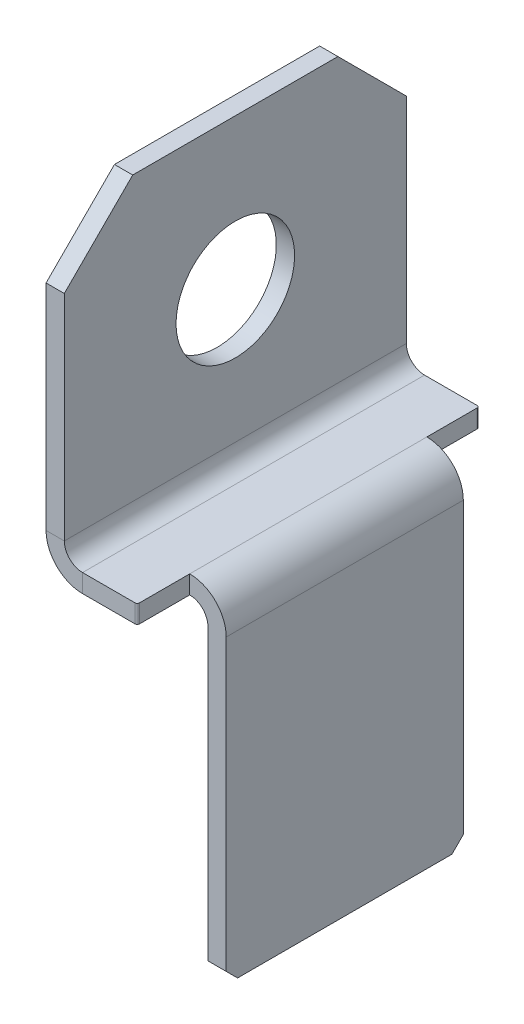
ISO-10303-21;
HEADER;
FILE_DESCRIPTION(('STEP AP214'),'2;1');
FILE_NAME('part.step','',(''),(''),'','','');
FILE_SCHEMA(('AUTOMOTIVE_DESIGN { 1 0 10303 214 1 1 1 1 }'));
ENDSEC;
DATA;
#1=APPLICATION_CONTEXT('core data for automotive mechanical design processes');
#2=APPLICATION_PROTOCOL_DEFINITION('international standard','automotive_design',2000,#1);
#3=PRODUCT_CONTEXT('',#1,'mechanical');
#4=PRODUCT('Part','Part','',(#3));
#5=PRODUCT_RELATED_PRODUCT_CATEGORY('part','',(#4));
#6=PRODUCT_DEFINITION_FORMATION('','',#4);
#7=PRODUCT_DEFINITION_CONTEXT('part definition',#1,'design');
#8=PRODUCT_DEFINITION('design','',#6,#7);
#9=PRODUCT_DEFINITION_SHAPE('','',#8);
#10=(LENGTH_UNIT() NAMED_UNIT(*) SI_UNIT(.MILLI.,.METRE.));
#11=(NAMED_UNIT(*) PLANE_ANGLE_UNIT() SI_UNIT($,.RADIAN.));
#12=(NAMED_UNIT(*) SI_UNIT($,.STERADIAN.) SOLID_ANGLE_UNIT());
#13=UNCERTAINTY_MEASURE_WITH_UNIT(LENGTH_MEASURE(1.E-05),#10,'distance_accuracy_value','');
#14=(GEOMETRIC_REPRESENTATION_CONTEXT(3) GLOBAL_UNCERTAINTY_ASSIGNED_CONTEXT((#13)) GLOBAL_UNIT_ASSIGNED_CONTEXT((#10,
#11,#12)) REPRESENTATION_CONTEXT('',''));
#15=CARTESIAN_POINT('',(0.,0.,0.));
#16=DIRECTION('',(0.,0.,1.));
#17=DIRECTION('',(1.,0.,0.));
#18=AXIS2_PLACEMENT_3D('',#15,#16,#17);
#19=CARTESIAN_POINT('',(0.8,0.,15.));
#20=DIRECTION('',(-1.,0.,0.));
#21=DIRECTION('',(0.,0.,1.));
#22=AXIS2_PLACEMENT_3D('',#19,#20,#21);
#23=PLANE('',#22);
#24=DIRECTION('',(0.,1.,0.));
#25=VECTOR('',#24,1.);
#26=CARTESIAN_POINT('',(0.8,0.,12.7));
#27=LINE('',#26,#25);
#28=CARTESIAN_POINT('',(0.8,0.5,12.7));
#29=VERTEX_POINT('',#28);
#30=CARTESIAN_POINT('',(0.8,13.2,12.7));
#31=VERTEX_POINT('',#30);
#32=EDGE_CURVE('E198',#29,#31,#27,.T.);
#33=ORIENTED_EDGE('',*,*,#32,.F.);
#34=DIRECTION('',(0.,-0.70710678118655,-0.707106781186545));
#35=VECTOR('',#34,1.);
#36=CARTESIAN_POINT('',(0.8,0.5,12.7));
#37=LINE('',#36,#35);
#38=CARTESIAN_POINT('',(0.8,0.,12.2));
#39=VERTEX_POINT('',#38);
#40=EDGE_CURVE('E283',#29,#39,#37,.T.);
#41=ORIENTED_EDGE('',*,*,#40,.T.);
#42=DIRECTION('',(0.,0.,-1.));
#43=VECTOR('',#42,1.);
#44=CARTESIAN_POINT('',(0.8,0.,15.));
#45=LINE('',#44,#43);
#46=CARTESIAN_POINT('',(0.8,0.,2.8));
#47=VERTEX_POINT('',#46);
#48=EDGE_CURVE('E300',#39,#47,#45,.T.);
#49=ORIENTED_EDGE('',*,*,#48,.T.);
#50=DIRECTION('',(0.,-0.70710678118655,0.707106781186545));
#51=VECTOR('',#50,1.);
#52=CARTESIAN_POINT('',(0.8,0.5,2.3));
#53=LINE('',#52,#51);
#54=CARTESIAN_POINT('',(0.8,0.5,2.3));
#55=VERTEX_POINT('',#54);
#56=EDGE_CURVE('E281',#47,#55,#53,.F.);
#57=ORIENTED_EDGE('',*,*,#56,.T.);
#58=DIRECTION('',(0.,-1.,0.));
#59=VECTOR('',#58,1.);
#60=CARTESIAN_POINT('',(0.8,0.,2.3));
#61=LINE('',#60,#59);
#62=CARTESIAN_POINT('',(0.8,13.2,2.3));
#63=VERTEX_POINT('',#62);
#64=EDGE_CURVE('E355',#63,#55,#61,.T.);
#65=ORIENTED_EDGE('',*,*,#64,.F.);
#66=DIRECTION('',(0.,0.,-1.));
#67=VECTOR('',#66,1.);
#68=CARTESIAN_POINT('',(0.8,13.2,15.));
#69=LINE('',#68,#67);
#70=EDGE_CURVE('E305',#31,#63,#69,.T.);
#71=ORIENTED_EDGE('',*,*,#70,.F.);
#72=EDGE_LOOP('',(#33,#41,#49,#57,#65,#71));
#73=FACE_BOUND('',#72,.T.);
#74=ADVANCED_FACE('F38',(#73),#23,.F.);
#75=CARTESIAN_POINT('',(-0.8,13.2,15.));
#76=DIRECTION('',(0.,0.,-1.));
#77=DIRECTION('',(-1.,0.,0.));
#78=AXIS2_PLACEMENT_3D('',#75,#76,#77);
#79=CYLINDRICAL_SURFACE('',#78,0.8);
#80=CARTESIAN_POINT('',(-0.8,13.2,12.7));
#81=DIRECTION('',(0.,0.,-1.));
#82=DIRECTION('',(-1.,0.,0.));
#83=AXIS2_PLACEMENT_3D('',#80,#81,#82);
#84=CIRCLE('',#83,0.8);
#85=CARTESIAN_POINT('',(-0.8,14.,12.7));
#86=VERTEX_POINT('',#85);
#87=CARTESIAN_POINT('',(0.,13.2,12.7));
#88=VERTEX_POINT('',#87);
#89=EDGE_CURVE('E193',#86,#88,#84,.T.);
#90=ORIENTED_EDGE('',*,*,#89,.F.);
#91=DIRECTION('',(0.,0.,-1.));
#92=VECTOR('',#91,1.);
#93=CARTESIAN_POINT('',(-0.8,14.,15.));
#94=LINE('',#93,#92);
#95=CARTESIAN_POINT('',(-0.8,14.,2.3));
#96=VERTEX_POINT('',#95);
#97=EDGE_CURVE('E187',#86,#96,#94,.T.);
#98=ORIENTED_EDGE('',*,*,#97,.T.);
#99=CARTESIAN_POINT('',(-0.8,13.2,2.3));
#100=DIRECTION('',(0.,0.,-1.));
#101=DIRECTION('',(-1.,0.,0.));
#102=AXIS2_PLACEMENT_3D('',#99,#100,#101);
#103=CIRCLE('',#102,0.8);
#104=CARTESIAN_POINT('',(0.,13.2,2.3));
#105=VERTEX_POINT('',#104);
#106=EDGE_CURVE('E336',#96,#105,#103,.T.);
#107=ORIENTED_EDGE('',*,*,#106,.T.);
#108=DIRECTION('',(0.,0.,-1.));
#109=VECTOR('',#108,1.);
#110=CARTESIAN_POINT('',(0.,13.2,15.));
#111=LINE('',#110,#109);
#112=EDGE_CURVE('E207',#88,#105,#111,.T.);
#113=ORIENTED_EDGE('',*,*,#112,.F.);
#114=EDGE_LOOP('',(#90,#98,#107,#113));
#115=FACE_BOUND('',#114,.T.);
#116=ADVANCED_FACE('F204',(#115),#79,.F.);
#117=CARTESIAN_POINT('',(0.,0.,15.));
#118=DIRECTION('',(-1.,0.,0.));
#119=DIRECTION('',(0.,0.,1.));
#120=AXIS2_PLACEMENT_3D('',#117,#118,#119);
#121=PLANE('',#120);
#122=DIRECTION('',(0.,0.,-1.));
#123=VECTOR('',#122,1.);
#124=CARTESIAN_POINT('',(0.,0.,15.));
#125=LINE('',#124,#123);
#126=CARTESIAN_POINT('',(0.,0.,12.2));
#127=VERTEX_POINT('',#126);
#128=CARTESIAN_POINT('',(0.,0.,2.8));
#129=VERTEX_POINT('',#128);
#130=EDGE_CURVE('E214',#127,#129,#125,.T.);
#131=ORIENTED_EDGE('',*,*,#130,.F.);
#132=DIRECTION('',(0.,0.70710678118655,0.707106781186545));
#133=VECTOR('',#132,1.);
#134=CARTESIAN_POINT('',(0.,1.4,13.6));
#135=LINE('',#134,#133);
#136=CARTESIAN_POINT('',(0.,0.5,12.7));
#137=VERTEX_POINT('',#136);
#138=EDGE_CURVE('E46',#127,#137,#135,.T.);
#139=ORIENTED_EDGE('',*,*,#138,.T.);
#140=DIRECTION('',(0.,-1.,0.));
#141=VECTOR('',#140,1.);
#142=CARTESIAN_POINT('',(0.,0.,12.7));
#143=LINE('',#142,#141);
#144=EDGE_CURVE('E209',#88,#137,#143,.T.);
#145=ORIENTED_EDGE('',*,*,#144,.F.);
#146=ORIENTED_EDGE('',*,*,#112,.T.);
#147=DIRECTION('',(0.,-1.,0.));
#148=VECTOR('',#147,1.);
#149=CARTESIAN_POINT('',(0.,0.,2.3));
#150=LINE('',#149,#148);
#151=CARTESIAN_POINT('',(0.,0.5,2.3));
#152=VERTEX_POINT('',#151);
#153=EDGE_CURVE('E352',#105,#152,#150,.T.);
#154=ORIENTED_EDGE('',*,*,#153,.T.);
#155=DIRECTION('',(0.,0.70710678118655,-0.707106781186545));
#156=VECTOR('',#155,1.);
#157=CARTESIAN_POINT('',(0.,-6.1,8.89999999999996));
#158=LINE('',#157,#156);
#159=EDGE_CURVE('E53',#152,#129,#158,.F.);
#160=ORIENTED_EDGE('',*,*,#159,.T.);
#161=EDGE_LOOP('',(#131,#139,#145,#146,#154,#160));
#162=FACE_BOUND('',#161,.T.);
#163=ADVANCED_FACE('F290',(#162),#121,.T.);
#164=CARTESIAN_POINT('',(0.8,0.,15.));
#165=DIRECTION('',(0.,-1.,0.));
#166=DIRECTION('',(0.,0.,-1.));
#167=AXIS2_PLACEMENT_3D('',#164,#165,#166);
#168=PLANE('',#167);
#169=ORIENTED_EDGE('',*,*,#48,.F.);
#170=DIRECTION('',(-1.,0.,0.));
#171=VECTOR('',#170,1.);
#172=CARTESIAN_POINT('',(0.,0.,12.2));
#173=LINE('',#172,#171);
#174=EDGE_CURVE('E287',#39,#127,#173,.T.);
#175=ORIENTED_EDGE('',*,*,#174,.T.);
#176=ORIENTED_EDGE('',*,*,#130,.T.);
#177=DIRECTION('',(1.,0.,0.));
#178=VECTOR('',#177,1.);
#179=CARTESIAN_POINT('',(0.8,0.,2.8));
#180=LINE('',#179,#178);
#181=EDGE_CURVE('E285',#129,#47,#180,.T.);
#182=ORIENTED_EDGE('',*,*,#181,.T.);
#183=EDGE_LOOP('',(#169,#175,#176,#182));
#184=FACE_BOUND('',#183,.T.);
#185=ADVANCED_FACE('F304',(#184),#168,.T.);
#186=CARTESIAN_POINT('',(-0.8,13.2,15.));
#187=DIRECTION('',(0.,0.,-1.));
#188=DIRECTION('',(-1.,0.,0.));
#189=AXIS2_PLACEMENT_3D('',#186,#187,#188);
#190=CYLINDRICAL_SURFACE('',#189,1.6);
#191=DIRECTION('',(0.,0.,-1.));
#192=VECTOR('',#191,1.);
#193=CARTESIAN_POINT('',(-0.8,14.8,15.));
#194=LINE('',#193,#192);
#195=CARTESIAN_POINT('',(-0.8,14.8,12.7));
#196=VERTEX_POINT('',#195);
#197=CARTESIAN_POINT('',(-0.8,14.8,2.3));
#198=VERTEX_POINT('',#197);
#199=EDGE_CURVE('E311',#196,#198,#194,.T.);
#200=ORIENTED_EDGE('',*,*,#199,.F.);
#201=CARTESIAN_POINT('',(-0.8,13.2,12.7));
#202=DIRECTION('',(0.,0.,-1.));
#203=DIRECTION('',(-1.,0.,0.));
#204=AXIS2_PLACEMENT_3D('',#201,#202,#203);
#205=CIRCLE('',#204,1.6);
#206=EDGE_CURVE('E196',#196,#31,#205,.T.);
#207=ORIENTED_EDGE('',*,*,#206,.T.);
#208=ORIENTED_EDGE('',*,*,#70,.T.);
#209=CARTESIAN_POINT('',(-0.8,13.2,2.3));
#210=DIRECTION('',(0.,0.,-1.));
#211=DIRECTION('',(-1.,0.,0.));
#212=AXIS2_PLACEMENT_3D('',#209,#210,#211);
#213=CIRCLE('',#212,1.6);
#214=EDGE_CURVE('E239',#198,#63,#213,.T.);
#215=ORIENTED_EDGE('',*,*,#214,.F.);
#216=EDGE_LOOP('',(#200,#207,#208,#215));
#217=FACE_BOUND('',#216,.T.);
#218=ADVANCED_FACE('F445',(#217),#190,.T.);
#219=CARTESIAN_POINT('',(0.8,13.2,15.));
#220=DIRECTION('',(0.,0.,1.));
#221=DIRECTION('',(1.,0.,0.));
#222=AXIS2_PLACEMENT_3D('',#219,#220,#221);
#223=PLANE('',#222);
#224=DIRECTION('',(-1.,0.,0.));
#225=VECTOR('',#224,1.);
#226=CARTESIAN_POINT('',(0.,14.,15.));
#227=LINE('',#226,#225);
#228=CARTESIAN_POINT('',(-0.9,14.,15.));
#229=VERTEX_POINT('',#228);
#230=CARTESIAN_POINT('',(-3.2,14.,15.));
#231=VERTEX_POINT('',#230);
#232=EDGE_CURVE('E341',#229,#231,#227,.T.);
#233=ORIENTED_EDGE('',*,*,#232,.F.);
#234=DIRECTION('',(0.,1.,0.));
#235=VECTOR('',#234,1.);
#236=CARTESIAN_POINT('',(-0.9,13.2,15.));
#237=LINE('',#236,#235);
#238=CARTESIAN_POINT('',(-0.9,14.8,15.));
#239=VERTEX_POINT('',#238);
#240=EDGE_CURVE('E261',#229,#239,#237,.T.);
#241=ORIENTED_EDGE('',*,*,#240,.T.);
#242=DIRECTION('',(1.,0.,0.));
#243=VECTOR('',#242,1.);
#244=CARTESIAN_POINT('',(0.,14.8,15.));
#245=LINE('',#244,#243);
#246=CARTESIAN_POINT('',(-3.2,14.8,15.));
#247=VERTEX_POINT('',#246);
#248=EDGE_CURVE('E339',#239,#247,#245,.F.);
#249=ORIENTED_EDGE('',*,*,#248,.T.);
#250=DIRECTION('',(0.,-1.,0.));
#251=VECTOR('',#250,1.);
#252=CARTESIAN_POINT('',(-3.2,14.8,15.));
#253=LINE('',#252,#251);
#254=EDGE_CURVE('E234',#247,#231,#253,.T.);
#255=ORIENTED_EDGE('',*,*,#254,.T.);
#256=EDGE_LOOP('',(#233,#241,#249,#255));
#257=FACE_BOUND('',#256,.T.);
#258=ADVANCED_FACE('F431',(#257),#223,.T.);
#259=CARTESIAN_POINT('',(-4.8,15.6,15.));
#260=DIRECTION('',(0.,0.,1.));
#261=DIRECTION('',(1.,0.,0.));
#262=AXIS2_PLACEMENT_3D('',#259,#260,#261);
#263=PLANE('',#262);
#264=DIRECTION('',(1.,0.,0.));
#265=VECTOR('',#264,1.);
#266=CARTESIAN_POINT('',(-4.8,15.6,15.));
#267=LINE('',#266,#265);
#268=CARTESIAN_POINT('',(-4.8,15.6,15.));
#269=VERTEX_POINT('',#268);
#270=CARTESIAN_POINT('',(-4.,15.6,15.));
#271=VERTEX_POINT('',#270);
#272=EDGE_CURVE('E237',#269,#271,#267,.T.);
#273=ORIENTED_EDGE('',*,*,#272,.F.);
#274=CARTESIAN_POINT('',(-3.2,15.6,15.));
#275=DIRECTION('',(0.,0.,1.));
#276=DIRECTION('',(1.,0.,0.));
#277=AXIS2_PLACEMENT_3D('',#274,#275,#276);
#278=CIRCLE('',#277,1.6);
#279=EDGE_CURVE('E343',#231,#269,#278,.F.);
#280=ORIENTED_EDGE('',*,*,#279,.F.);
#281=ORIENTED_EDGE('',*,*,#254,.F.);
#282=CARTESIAN_POINT('',(-3.2,15.6,15.));
#283=DIRECTION('',(0.,0.,1.));
#284=DIRECTION('',(1.,0.,0.));
#285=AXIS2_PLACEMENT_3D('',#282,#283,#284);
#286=CIRCLE('',#285,0.8);
#287=EDGE_CURVE('E318',#247,#271,#286,.F.);
#288=ORIENTED_EDGE('',*,*,#287,.T.);
#289=EDGE_LOOP('',(#273,#280,#281,#288));
#290=FACE_BOUND('',#289,.T.);
#291=ADVANCED_FACE('F412',(#290),#263,.T.);
#292=CARTESIAN_POINT('',(-3.2,14.8,15.));
#293=DIRECTION('',(0.,0.,1.));
#294=DIRECTION('',(1.,0.,0.));
#295=AXIS2_PLACEMENT_3D('',#292,#293,#294);
#296=PLANE('',#295);
#297=DIRECTION('',(0.,1.,0.));
#298=VECTOR('',#297,1.);
#299=CARTESIAN_POINT('',(-4.,14.,15.));
#300=LINE('',#299,#298);
#301=CARTESIAN_POINT('',(-4.,25.,15.));
#302=VERTEX_POINT('',#301);
#303=EDGE_CURVE('E322',#271,#302,#300,.T.);
#304=ORIENTED_EDGE('',*,*,#303,.T.);
#305=DIRECTION('',(-1.,0.,0.));
#306=VECTOR('',#305,1.);
#307=CARTESIAN_POINT('',(-3.2,25.,15.));
#308=LINE('',#307,#306);
#309=CARTESIAN_POINT('',(-4.8,25.,15.));
#310=VERTEX_POINT('',#309);
#311=EDGE_CURVE('E252',#302,#310,#308,.T.);
#312=ORIENTED_EDGE('',*,*,#311,.T.);
#313=DIRECTION('',(0.,1.,0.));
#314=VECTOR('',#313,1.);
#315=CARTESIAN_POINT('',(-4.8,14.,15.));
#316=LINE('',#315,#314);
#317=EDGE_CURVE('E346',#269,#310,#316,.T.);
#318=ORIENTED_EDGE('',*,*,#317,.F.);
#319=ORIENTED_EDGE('',*,*,#272,.T.);
#320=EDGE_LOOP('',(#304,#312,#318,#319));
#321=FACE_BOUND('',#320,.T.);
#322=ADVANCED_FACE('F416',(#321),#296,.T.);
#323=CARTESIAN_POINT('',(-3.2,14.,0.));
#324=DIRECTION('',(0.,0.,-1.));
#325=DIRECTION('',(-1.,0.,0.));
#326=AXIS2_PLACEMENT_3D('',#323,#324,#325);
#327=PLANE('',#326);
#328=DIRECTION('',(0.,1.,0.));
#329=VECTOR('',#328,1.);
#330=CARTESIAN_POINT('',(-3.2,14.,0.));
#331=LINE('',#330,#329);
#332=CARTESIAN_POINT('',(-3.2,14.,0.));
#333=VERTEX_POINT('',#332);
#334=CARTESIAN_POINT('',(-3.2,14.8,0.));
#335=VERTEX_POINT('',#334);
#336=EDGE_CURVE('E231',#333,#335,#331,.T.);
#337=ORIENTED_EDGE('',*,*,#336,.F.);
#338=CARTESIAN_POINT('',(-3.2,15.6,0.));
#339=DIRECTION('',(0.,0.,1.));
#340=DIRECTION('',(1.,0.,0.));
#341=AXIS2_PLACEMENT_3D('',#338,#339,#340);
#342=CIRCLE('',#341,1.6);
#343=CARTESIAN_POINT('',(-4.8,15.6,0.));
#344=VERTEX_POINT('',#343);
#345=EDGE_CURVE('E327',#333,#344,#342,.F.);
#346=ORIENTED_EDGE('',*,*,#345,.T.);
#347=DIRECTION('',(-1.,0.,0.));
#348=VECTOR('',#347,1.);
#349=CARTESIAN_POINT('',(-4.,15.6,0.));
#350=LINE('',#349,#348);
#351=CARTESIAN_POINT('',(-4.,15.6,0.));
#352=VERTEX_POINT('',#351);
#353=EDGE_CURVE('E229',#352,#344,#350,.T.);
#354=ORIENTED_EDGE('',*,*,#353,.F.);
#355=CARTESIAN_POINT('',(-3.2,15.6,0.));
#356=DIRECTION('',(0.,0.,1.));
#357=DIRECTION('',(1.,0.,0.));
#358=AXIS2_PLACEMENT_3D('',#355,#356,#357);
#359=CIRCLE('',#358,0.8);
#360=EDGE_CURVE('E319',#335,#352,#359,.F.);
#361=ORIENTED_EDGE('',*,*,#360,.F.);
#362=EDGE_LOOP('',(#337,#346,#354,#361));
#363=FACE_BOUND('',#362,.T.);
#364=ADVANCED_FACE('F405',(#363),#327,.T.);
#365=CARTESIAN_POINT('',(-4.,15.6,0.));
#366=DIRECTION('',(0.,0.,-1.));
#367=DIRECTION('',(-1.,0.,0.));
#368=AXIS2_PLACEMENT_3D('',#365,#366,#367);
#369=PLANE('',#368);
#370=DIRECTION('',(1.,0.,0.));
#371=VECTOR('',#370,1.);
#372=CARTESIAN_POINT('',(0.,14.8,0.));
#373=LINE('',#372,#371);
#374=CARTESIAN_POINT('',(-0.9,14.8,0.));
#375=VERTEX_POINT('',#374);
#376=EDGE_CURVE('E323',#375,#335,#373,.F.);
#377=ORIENTED_EDGE('',*,*,#376,.F.);
#378=DIRECTION('',(0.,-1.,0.));
#379=VECTOR('',#378,1.);
#380=CARTESIAN_POINT('',(-0.9,15.6,0.));
#381=LINE('',#380,#379);
#382=CARTESIAN_POINT('',(-0.9,14.,0.));
#383=VERTEX_POINT('',#382);
#384=EDGE_CURVE('E273',#375,#383,#381,.T.);
#385=ORIENTED_EDGE('',*,*,#384,.T.);
#386=DIRECTION('',(-1.,0.,0.));
#387=VECTOR('',#386,1.);
#388=CARTESIAN_POINT('',(0.,14.,0.));
#389=LINE('',#388,#387);
#390=EDGE_CURVE('E325',#383,#333,#389,.T.);
#391=ORIENTED_EDGE('',*,*,#390,.T.);
#392=ORIENTED_EDGE('',*,*,#336,.T.);
#393=EDGE_LOOP('',(#377,#385,#391,#392));
#394=FACE_BOUND('',#393,.T.);
#395=ADVANCED_FACE('F426',(#394),#369,.T.);
#396=CARTESIAN_POINT('',(-4.,14.,15.));
#397=DIRECTION('',(-1.,0.,0.));
#398=DIRECTION('',(0.,0.,1.));
#399=AXIS2_PLACEMENT_3D('',#396,#397,#398);
#400=PLANE('',#399);
#401=CARTESIAN_POINT('',(-4.,21.4,7.5));
#402=DIRECTION('',(-1.,0.,0.));
#403=DIRECTION('',(0.,0.,1.));
#404=AXIS2_PLACEMENT_3D('',#401,#402,#403);
#405=CIRCLE('',#404,2.6);
#406=CARTESIAN_POINT('',(-4.,21.4,10.1));
#407=VERTEX_POINT('',#406);
#408=EDGE_CURVE('E199',#407,#407,#405,.F.);
#409=ORIENTED_EDGE('',*,*,#408,.F.);
#410=EDGE_LOOP('',(#409));
#411=FACE_BOUND('',#410,.T.);
#412=DIRECTION('',(0.,0.,-1.));
#413=VECTOR('',#412,1.);
#414=CARTESIAN_POINT('',(-4.,28.,15.));
#415=LINE('',#414,#413);
#416=CARTESIAN_POINT('',(-4.,28.,12.));
#417=VERTEX_POINT('',#416);
#418=CARTESIAN_POINT('',(-4.,28.,3.00000000000002));
#419=VERTEX_POINT('',#418);
#420=EDGE_CURVE('E226',#417,#419,#415,.T.);
#421=ORIENTED_EDGE('',*,*,#420,.F.);
#422=DIRECTION('',(0.,0.707106781186549,-0.707106781186546));
#423=VECTOR('',#422,1.);
#424=CARTESIAN_POINT('',(-4.,28.,12.));
#425=LINE('',#424,#423);
#426=EDGE_CURVE('E250',#417,#302,#425,.F.);
#427=ORIENTED_EDGE('',*,*,#426,.T.);
#428=ORIENTED_EDGE('',*,*,#303,.F.);
#429=DIRECTION('',(0.,0.,-1.));
#430=VECTOR('',#429,1.);
#431=CARTESIAN_POINT('',(-4.,15.6,15.));
#432=LINE('',#431,#430);
#433=EDGE_CURVE('E315',#271,#352,#432,.T.);
#434=ORIENTED_EDGE('',*,*,#433,.T.);
#435=DIRECTION('',(0.,1.,0.));
#436=VECTOR('',#435,1.);
#437=CARTESIAN_POINT('',(-4.,14.,0.));
#438=LINE('',#437,#436);
#439=CARTESIAN_POINT('',(-4.,25.,0.));
#440=VERTEX_POINT('',#439);
#441=EDGE_CURVE('E333',#352,#440,#438,.T.);
#442=ORIENTED_EDGE('',*,*,#441,.T.);
#443=DIRECTION('',(0.,0.707106781186546,0.707106781186549));
#444=VECTOR('',#443,1.);
#445=CARTESIAN_POINT('',(-4.,25.,0.));
#446=LINE('',#445,#444);
#447=EDGE_CURVE('E248',#440,#419,#446,.T.);
#448=ORIENTED_EDGE('',*,*,#447,.T.);
#449=EDGE_LOOP('',(#421,#427,#428,#434,#442,#448));
#450=FACE_BOUND('',#449,.T.);
#451=ADVANCED_FACE('F393',(#411,#450),#400,.F.);
#452=CARTESIAN_POINT('',(-4.8,28.,15.));
#453=DIRECTION('',(0.,1.,0.));
#454=DIRECTION('',(0.,0.,1.));
#455=AXIS2_PLACEMENT_3D('',#452,#453,#454);
#456=PLANE('',#455);
#457=DIRECTION('',(0.,0.,-1.));
#458=VECTOR('',#457,1.);
#459=CARTESIAN_POINT('',(-4.8,28.,15.));
#460=LINE('',#459,#458);
#461=CARTESIAN_POINT('',(-4.8,28.,12.));
#462=VERTEX_POINT('',#461);
#463=CARTESIAN_POINT('',(-4.8,28.,3.00000000000002));
#464=VERTEX_POINT('',#463);
#465=EDGE_CURVE('E223',#462,#464,#460,.T.);
#466=ORIENTED_EDGE('',*,*,#465,.F.);
#467=DIRECTION('',(1.,0.,0.));
#468=VECTOR('',#467,1.);
#469=CARTESIAN_POINT('',(-4.8,28.,12.));
#470=LINE('',#469,#468);
#471=EDGE_CURVE('E245',#462,#417,#470,.T.);
#472=ORIENTED_EDGE('',*,*,#471,.T.);
#473=ORIENTED_EDGE('',*,*,#420,.T.);
#474=DIRECTION('',(-1.,0.,0.));
#475=VECTOR('',#474,1.);
#476=CARTESIAN_POINT('',(-4.8,28.,3.00000000000002));
#477=LINE('',#476,#475);
#478=EDGE_CURVE('E243',#419,#464,#477,.T.);
#479=ORIENTED_EDGE('',*,*,#478,.T.);
#480=EDGE_LOOP('',(#466,#472,#473,#479));
#481=FACE_BOUND('',#480,.T.);
#482=ADVANCED_FACE('F377',(#481),#456,.T.);
#483=CARTESIAN_POINT('',(-4.8,14.,15.));
#484=DIRECTION('',(-1.,0.,0.));
#485=DIRECTION('',(0.,0.,1.));
#486=AXIS2_PLACEMENT_3D('',#483,#484,#485);
#487=PLANE('',#486);
#488=CARTESIAN_POINT('',(-4.8,21.4,7.5));
#489=DIRECTION('',(-1.,0.,0.));
#490=DIRECTION('',(0.,0.,1.));
#491=AXIS2_PLACEMENT_3D('',#488,#489,#490);
#492=CIRCLE('',#491,2.6);
#493=CARTESIAN_POINT('',(-4.8,21.4,10.1));
#494=VERTEX_POINT('',#493);
#495=EDGE_CURVE('E366',#494,#494,#492,.T.);
#496=ORIENTED_EDGE('',*,*,#495,.F.);
#497=EDGE_LOOP('',(#496));
#498=FACE_BOUND('',#497,.T.);
#499=ORIENTED_EDGE('',*,*,#317,.T.);
#500=DIRECTION('',(0.,-0.707106781186549,0.707106781186546));
#501=VECTOR('',#500,1.);
#502=CARTESIAN_POINT('',(-4.8,19.5,20.5));
#503=LINE('',#502,#501);
#504=EDGE_CURVE('E256',#310,#462,#503,.F.);
#505=ORIENTED_EDGE('',*,*,#504,.T.);
#506=ORIENTED_EDGE('',*,*,#465,.T.);
#507=DIRECTION('',(0.,-0.707106781186546,-0.707106781186549));
#508=VECTOR('',#507,1.);
#509=CARTESIAN_POINT('',(-4.8,27.,2.00000000000004));
#510=LINE('',#509,#508);
#511=CARTESIAN_POINT('',(-4.8,25.,0.));
#512=VERTEX_POINT('',#511);
#513=EDGE_CURVE('E254',#464,#512,#510,.T.);
#514=ORIENTED_EDGE('',*,*,#513,.T.);
#515=DIRECTION('',(0.,1.,0.));
#516=VECTOR('',#515,1.);
#517=CARTESIAN_POINT('',(-4.8,14.,0.));
#518=LINE('',#517,#516);
#519=EDGE_CURVE('E330',#344,#512,#518,.T.);
#520=ORIENTED_EDGE('',*,*,#519,.F.);
#521=DIRECTION('',(0.,0.,-1.));
#522=VECTOR('',#521,1.);
#523=CARTESIAN_POINT('',(-4.8,15.6,15.));
#524=LINE('',#523,#522);
#525=EDGE_CURVE('E220',#269,#344,#524,.T.);
#526=ORIENTED_EDGE('',*,*,#525,.F.);
#527=EDGE_LOOP('',(#499,#505,#506,#514,#520,#526));
#528=FACE_BOUND('',#527,.T.);
#529=ADVANCED_FACE('F373',(#498,#528),#487,.T.);
#530=CARTESIAN_POINT('',(-3.2,15.6,15.));
#531=DIRECTION('',(0.,0.,-1.));
#532=DIRECTION('',(-1.,0.,0.));
#533=AXIS2_PLACEMENT_3D('',#530,#531,#532);
#534=CYLINDRICAL_SURFACE('',#533,1.6);
#535=ORIENTED_EDGE('',*,*,#345,.F.);
#536=DIRECTION('',(0.,0.,-1.));
#537=VECTOR('',#536,1.);
#538=CARTESIAN_POINT('',(-3.2,14.,15.));
#539=LINE('',#538,#537);
#540=EDGE_CURVE('E186',#231,#333,#539,.T.);
#541=ORIENTED_EDGE('',*,*,#540,.F.);
#542=ORIENTED_EDGE('',*,*,#279,.T.);
#543=ORIENTED_EDGE('',*,*,#525,.T.);
#544=EDGE_LOOP('',(#535,#541,#542,#543));
#545=FACE_BOUND('',#544,.T.);
#546=ADVANCED_FACE('F376',(#545),#534,.T.);
#547=CARTESIAN_POINT('',(0.,14.,15.));
#548=DIRECTION('',(0.,-1.,0.));
#549=DIRECTION('',(0.,0.,-1.));
#550=AXIS2_PLACEMENT_3D('',#547,#548,#549);
#551=PLANE('',#550);
#552=CARTESIAN_POINT('',(-0.8,14.,14.9));
#553=VERTEX_POINT('',#552);
#554=EDGE_CURVE('E175',#553,#86,#94,.T.);
#555=ORIENTED_EDGE('',*,*,#554,.F.);
#556=CARTESIAN_POINT('',(-0.9,14.,14.9));
#557=DIRECTION('',(0.,-1.,0.));
#558=DIRECTION('',(0.,0.,-1.));
#559=AXIS2_PLACEMENT_3D('',#556,#557,#558);
#560=CIRCLE('',#559,0.1);
#561=EDGE_CURVE('E271',#553,#229,#560,.T.);
#562=ORIENTED_EDGE('',*,*,#561,.T.);
#563=ORIENTED_EDGE('',*,*,#232,.T.);
#564=ORIENTED_EDGE('',*,*,#540,.T.);
#565=ORIENTED_EDGE('',*,*,#390,.F.);
#566=CARTESIAN_POINT('',(-0.9,14.,0.1));
#567=DIRECTION('',(0.,-1.,0.));
#568=DIRECTION('',(0.,0.,-1.));
#569=AXIS2_PLACEMENT_3D('',#566,#567,#568);
#570=CIRCLE('',#569,0.1);
#571=CARTESIAN_POINT('',(-0.8,14.,0.0999999999999994));
#572=VERTEX_POINT('',#571);
#573=EDGE_CURVE('E269',#383,#572,#570,.T.);
#574=ORIENTED_EDGE('',*,*,#573,.T.);
#575=DIRECTION('',(0.,0.,-1.));
#576=VECTOR('',#575,1.);
#577=CARTESIAN_POINT('',(-0.8,14.,15.));
#578=LINE('',#577,#576);
#579=EDGE_CURVE('E213',#572,#96,#578,.F.);
#580=ORIENTED_EDGE('',*,*,#579,.T.);
#581=ORIENTED_EDGE('',*,*,#97,.F.);
#582=EDGE_LOOP('',(#555,#562,#563,#564,#565,#574,#580,#581));
#583=FACE_BOUND('',#582,.T.);
#584=ADVANCED_FACE('F211',(#583),#551,.T.);
#585=CARTESIAN_POINT('',(0.,14.8,15.));
#586=DIRECTION('',(0.,-1.,0.));
#587=DIRECTION('',(0.,0.,-1.));
#588=AXIS2_PLACEMENT_3D('',#585,#586,#587);
#589=PLANE('',#588);
#590=ORIENTED_EDGE('',*,*,#248,.F.);
#591=CARTESIAN_POINT('',(-0.9,14.8,14.9));
#592=DIRECTION('',(0.,-1.,0.));
#593=DIRECTION('',(0.,0.,-1.));
#594=AXIS2_PLACEMENT_3D('',#591,#592,#593);
#595=CIRCLE('',#594,0.1);
#596=CARTESIAN_POINT('',(-0.8,14.8,14.9));
#597=VERTEX_POINT('',#596);
#598=EDGE_CURVE('E266',#239,#597,#595,.F.);
#599=ORIENTED_EDGE('',*,*,#598,.T.);
#600=EDGE_CURVE('E307',#597,#196,#194,.T.);
#601=ORIENTED_EDGE('',*,*,#600,.T.);
#602=ORIENTED_EDGE('',*,*,#199,.T.);
#603=DIRECTION('',(0.,0.,-1.));
#604=VECTOR('',#603,1.);
#605=CARTESIAN_POINT('',(-0.8,14.8,0.));
#606=LINE('',#605,#604);
#607=CARTESIAN_POINT('',(-0.8,14.8,0.1));
#608=VERTEX_POINT('',#607);
#609=EDGE_CURVE('E208',#198,#608,#606,.T.);
#610=ORIENTED_EDGE('',*,*,#609,.T.);
#611=CARTESIAN_POINT('',(-0.9,14.8,0.1));
#612=DIRECTION('',(0.,-1.,0.));
#613=DIRECTION('',(0.,0.,-1.));
#614=AXIS2_PLACEMENT_3D('',#611,#612,#613);
#615=CIRCLE('',#614,0.1);
#616=EDGE_CURVE('E264',#608,#375,#615,.F.);
#617=ORIENTED_EDGE('',*,*,#616,.T.);
#618=ORIENTED_EDGE('',*,*,#376,.T.);
#619=DIRECTION('',(0.,0.,-1.));
#620=VECTOR('',#619,1.);
#621=CARTESIAN_POINT('',(-3.2,14.8,15.));
#622=LINE('',#621,#620);
#623=EDGE_CURVE('E312',#247,#335,#622,.T.);
#624=ORIENTED_EDGE('',*,*,#623,.F.);
#625=EDGE_LOOP('',(#590,#599,#601,#602,#610,#617,#618,#624));
#626=FACE_BOUND('',#625,.T.);
#627=ADVANCED_FACE('F421',(#626),#589,.F.);
#628=CARTESIAN_POINT('',(-3.2,15.6,15.));
#629=DIRECTION('',(0.,0.,-1.));
#630=DIRECTION('',(-1.,0.,0.));
#631=AXIS2_PLACEMENT_3D('',#628,#629,#630);
#632=CYLINDRICAL_SURFACE('',#631,0.8);
#633=ORIENTED_EDGE('',*,*,#360,.T.);
#634=ORIENTED_EDGE('',*,*,#433,.F.);
#635=ORIENTED_EDGE('',*,*,#287,.F.);
#636=ORIENTED_EDGE('',*,*,#623,.T.);
#637=EDGE_LOOP('',(#633,#634,#635,#636));
#638=FACE_BOUND('',#637,.T.);
#639=ADVANCED_FACE('F418',(#638),#632,.F.);
#640=CARTESIAN_POINT('',(-3.2,15.6,0.));
#641=DIRECTION('',(0.,0.,1.));
#642=DIRECTION('',(1.,0.,0.));
#643=AXIS2_PLACEMENT_3D('',#640,#641,#642);
#644=PLANE('',#643);
#645=ORIENTED_EDGE('',*,*,#519,.T.);
#646=DIRECTION('',(1.,0.,0.));
#647=VECTOR('',#646,1.);
#648=CARTESIAN_POINT('',(-4.,25.,0.));
#649=LINE('',#648,#647);
#650=EDGE_CURVE('E258',#512,#440,#649,.T.);
#651=ORIENTED_EDGE('',*,*,#650,.T.);
#652=ORIENTED_EDGE('',*,*,#441,.F.);
#653=ORIENTED_EDGE('',*,*,#353,.T.);
#654=EDGE_LOOP('',(#645,#651,#652,#653));
#655=FACE_BOUND('',#654,.T.);
#656=ADVANCED_FACE('F401',(#655),#644,.F.);
#657=CARTESIAN_POINT('',(0.800012,0.,2.3));
#658=DIRECTION('',(0.,0.,-1.));
#659=DIRECTION('',(-1.,0.,0.));
#660=AXIS2_PLACEMENT_3D('',#657,#658,#659);
#661=PLANE('',#660);
#662=ORIENTED_EDGE('',*,*,#64,.T.);
#663=DIRECTION('',(-1.,0.,0.));
#664=VECTOR('',#663,1.);
#665=CARTESIAN_POINT('',(0.800012,0.5,2.3));
#666=LINE('',#665,#664);
#667=EDGE_CURVE('E12',#55,#152,#666,.T.);
#668=ORIENTED_EDGE('',*,*,#667,.T.);
#669=ORIENTED_EDGE('',*,*,#153,.F.);
#670=ORIENTED_EDGE('',*,*,#106,.F.);
#671=DIRECTION('',(0.,-1.,0.));
#672=VECTOR('',#671,1.);
#673=CARTESIAN_POINT('',(-0.8,0.,2.3));
#674=LINE('',#673,#672);
#675=EDGE_CURVE('E358',#198,#96,#674,.T.);
#676=ORIENTED_EDGE('',*,*,#675,.F.);
#677=ORIENTED_EDGE('',*,*,#214,.T.);
#678=EDGE_LOOP('',(#662,#668,#669,#670,#676,#677));
#679=FACE_BOUND('',#678,.T.);
#680=ADVANCED_FACE('F442',(#679),#661,.T.);
#681=CARTESIAN_POINT('',(-0.8,0.,0.));
#682=DIRECTION('',(1.,0.,0.));
#683=DIRECTION('',(0.,0.,-1.));
#684=AXIS2_PLACEMENT_3D('',#681,#682,#683);
#685=PLANE('',#684);
#686=ORIENTED_EDGE('',*,*,#579,.F.);
#687=DIRECTION('',(0.,-1.,0.));
#688=VECTOR('',#687,1.);
#689=CARTESIAN_POINT('',(-0.8,0.,0.1));
#690=LINE('',#689,#688);
#691=EDGE_CURVE('E276',#572,#608,#690,.F.);
#692=ORIENTED_EDGE('',*,*,#691,.T.);
#693=ORIENTED_EDGE('',*,*,#609,.F.);
#694=ORIENTED_EDGE('',*,*,#675,.T.);
#695=EDGE_LOOP('',(#686,#692,#693,#694));
#696=FACE_BOUND('',#695,.T.);
#697=ADVANCED_FACE('F439',(#696),#685,.T.);
#698=CARTESIAN_POINT('',(-0.8,0.,12.7));
#699=DIRECTION('',(0.,0.,-1.));
#700=DIRECTION('',(-1.,0.,0.));
#701=AXIS2_PLACEMENT_3D('',#698,#699,#700);
#702=PLANE('',#701);
#703=ORIENTED_EDGE('',*,*,#144,.T.);
#704=DIRECTION('',(1.,0.,0.));
#705=VECTOR('',#704,1.);
#706=CARTESIAN_POINT('',(0.8,0.5,12.7));
#707=LINE('',#706,#705);
#708=EDGE_CURVE('E278',#137,#29,#707,.T.);
#709=ORIENTED_EDGE('',*,*,#708,.T.);
#710=ORIENTED_EDGE('',*,*,#32,.T.);
#711=ORIENTED_EDGE('',*,*,#206,.F.);
#712=DIRECTION('',(0.,1.,0.));
#713=VECTOR('',#712,1.);
#714=CARTESIAN_POINT('',(-0.8,0.,12.7));
#715=LINE('',#714,#713);
#716=EDGE_CURVE('E179',#86,#196,#715,.T.);
#717=ORIENTED_EDGE('',*,*,#716,.F.);
#718=ORIENTED_EDGE('',*,*,#89,.T.);
#719=EDGE_LOOP('',(#703,#709,#710,#711,#717,#718));
#720=FACE_BOUND('',#719,.T.);
#721=ADVANCED_FACE('F192',(#720),#702,.F.);
#722=CARTESIAN_POINT('',(-0.8,0.,0.));
#723=DIRECTION('',(1.,0.,0.));
#724=DIRECTION('',(0.,0.,-1.));
#725=AXIS2_PLACEMENT_3D('',#722,#723,#724);
#726=PLANE('',#725);
#727=ORIENTED_EDGE('',*,*,#600,.F.);
#728=DIRECTION('',(0.,1.,0.));
#729=VECTOR('',#728,1.);
#730=CARTESIAN_POINT('',(-0.8,0.,14.9));
#731=LINE('',#730,#729);
#732=EDGE_CURVE('E182',#597,#553,#731,.F.);
#733=ORIENTED_EDGE('',*,*,#732,.T.);
#734=ORIENTED_EDGE('',*,*,#554,.T.);
#735=ORIENTED_EDGE('',*,*,#716,.T.);
#736=EDGE_LOOP('',(#727,#733,#734,#735));
#737=FACE_BOUND('',#736,.T.);
#738=ADVANCED_FACE('F178',(#737),#726,.T.);
#739=CARTESIAN_POINT('',(0.801,21.4,7.5));
#740=DIRECTION('',(-1.,0.,0.));
#741=DIRECTION('',(0.,0.,1.));
#742=AXIS2_PLACEMENT_3D('',#739,#740,#741);
#743=CYLINDRICAL_SURFACE('',#742,2.6);
#744=ORIENTED_EDGE('',*,*,#495,.T.);
#745=EDGE_LOOP('',(#744));
#746=FACE_BOUND('',#745,.T.);
#747=ORIENTED_EDGE('',*,*,#408,.T.);
#748=EDGE_LOOP('',(#747));
#749=FACE_BOUND('',#748,.T.);
#750=ADVANCED_FACE('F370',(#746,#749),#743,.F.);
#751=CARTESIAN_POINT('',(-4.8,28.,12.));
#752=DIRECTION('',(0.,-0.707106781186546,-0.707106781186549));
#753=DIRECTION('',(1.,0.,0.));
#754=AXIS2_PLACEMENT_3D('',#751,#752,#753);
#755=PLANE('',#754);
#756=ORIENTED_EDGE('',*,*,#504,.F.);
#757=ORIENTED_EDGE('',*,*,#311,.F.);
#758=ORIENTED_EDGE('',*,*,#426,.F.);
#759=ORIENTED_EDGE('',*,*,#471,.F.);
#760=EDGE_LOOP('',(#756,#757,#758,#759));
#761=FACE_BOUND('',#760,.T.);
#762=ADVANCED_FACE('F388',(#761),#755,.F.);
#763=CARTESIAN_POINT('',(-3.2,25.,0.));
#764=DIRECTION('',(0.,0.707106781186549,-0.707106781186546));
#765=DIRECTION('',(-1.,0.,0.));
#766=AXIS2_PLACEMENT_3D('',#763,#764,#765);
#767=PLANE('',#766);
#768=ORIENTED_EDGE('',*,*,#513,.F.);
#769=ORIENTED_EDGE('',*,*,#478,.F.);
#770=ORIENTED_EDGE('',*,*,#447,.F.);
#771=ORIENTED_EDGE('',*,*,#650,.F.);
#772=EDGE_LOOP('',(#768,#769,#770,#771));
#773=FACE_BOUND('',#772,.T.);
#774=ADVANCED_FACE('F399',(#773),#767,.T.);
#775=CARTESIAN_POINT('',(-0.9,13.2,14.9));
#776=DIRECTION('',(0.,1.,0.));
#777=DIRECTION('',(0.,0.,1.));
#778=AXIS2_PLACEMENT_3D('',#775,#776,#777);
#779=CYLINDRICAL_SURFACE('',#778,0.1);
#780=ORIENTED_EDGE('',*,*,#561,.F.);
#781=ORIENTED_EDGE('',*,*,#732,.F.);
#782=ORIENTED_EDGE('',*,*,#598,.F.);
#783=ORIENTED_EDGE('',*,*,#240,.F.);
#784=EDGE_LOOP('',(#780,#781,#782,#783));
#785=FACE_BOUND('',#784,.T.);
#786=ADVANCED_FACE('F433',(#785),#779,.T.);
#787=CARTESIAN_POINT('',(-0.9,15.6,0.1));
#788=DIRECTION('',(0.,-1.,0.));
#789=DIRECTION('',(0.,0.,-1.));
#790=AXIS2_PLACEMENT_3D('',#787,#788,#789);
#791=CYLINDRICAL_SURFACE('',#790,0.1);
#792=ORIENTED_EDGE('',*,*,#616,.F.);
#793=ORIENTED_EDGE('',*,*,#691,.F.);
#794=ORIENTED_EDGE('',*,*,#573,.F.);
#795=ORIENTED_EDGE('',*,*,#384,.F.);
#796=EDGE_LOOP('',(#792,#793,#794,#795));
#797=FACE_BOUND('',#796,.T.);
#798=ADVANCED_FACE('F450',(#797),#791,.T.);
#799=CARTESIAN_POINT('',(-0.8,0.5,12.7));
#800=DIRECTION('',(0.,-0.707106781186545,0.70710678118655));
#801=DIRECTION('',(-1.,0.,0.));
#802=AXIS2_PLACEMENT_3D('',#799,#800,#801);
#803=PLANE('',#802);
#804=ORIENTED_EDGE('',*,*,#138,.F.);
#805=ORIENTED_EDGE('',*,*,#174,.F.);
#806=ORIENTED_EDGE('',*,*,#40,.F.);
#807=ORIENTED_EDGE('',*,*,#708,.F.);
#808=EDGE_LOOP('',(#804,#805,#806,#807));
#809=FACE_BOUND('',#808,.T.);
#810=ADVANCED_FACE('F296',(#809),#803,.T.);
#811=CARTESIAN_POINT('',(0.800012,0.5,2.3));
#812=DIRECTION('',(0.,0.707106781186545,0.70710678118655));
#813=DIRECTION('',(-1.,0.,0.));
#814=AXIS2_PLACEMENT_3D('',#811,#812,#813);
#815=PLANE('',#814);
#816=ORIENTED_EDGE('',*,*,#56,.F.);
#817=ORIENTED_EDGE('',*,*,#181,.F.);
#818=ORIENTED_EDGE('',*,*,#159,.F.);
#819=ORIENTED_EDGE('',*,*,#667,.F.);
#820=EDGE_LOOP('',(#816,#817,#818,#819));
#821=FACE_BOUND('',#820,.T.);
#822=ADVANCED_FACE('F40',(#821),#815,.F.);
#823=CLOSED_SHELL('',(#74,#116,#163,#185,#218,#258,#291,#322,#364,#395,#451,#482,#529,#546,#584,
#627,#639,#656,#680,#697,#721,#738,#750,#762,#774,#786,#798,#810,#822));
#824=MANIFOLD_SOLID_BREP('B2',#823);
#825=ADVANCED_BREP_SHAPE_REPRESENTATION('',(#18,#824),#14);
#826=SHAPE_DEFINITION_REPRESENTATION(#9,#825);
ENDSEC;
END-ISO-10303-21;
